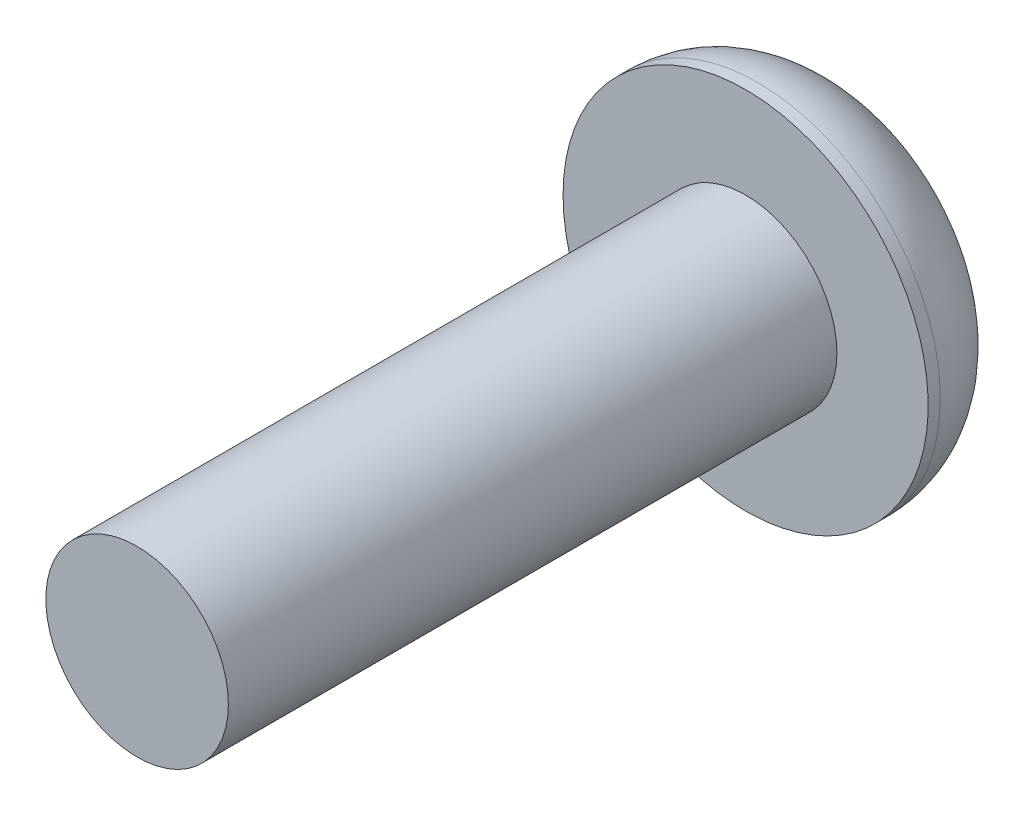
ISO-10303-21;
HEADER;
FILE_DESCRIPTION(('STEP AP214'),'2;1');
FILE_NAME('part.step','',(''),(''),'','','');
FILE_SCHEMA(('AUTOMOTIVE_DESIGN { 1 0 10303 214 1 1 1 1 }'));
ENDSEC;
DATA;
#1=APPLICATION_CONTEXT('core data for automotive mechanical design processes');
#2=APPLICATION_PROTOCOL_DEFINITION('international standard','automotive_design',2000,#1);
#3=PRODUCT_CONTEXT('',#1,'mechanical');
#4=PRODUCT('Part','Part','',(#3));
#5=PRODUCT_RELATED_PRODUCT_CATEGORY('part','',(#4));
#6=PRODUCT_DEFINITION_FORMATION('','',#4);
#7=PRODUCT_DEFINITION_CONTEXT('part definition',#1,'design');
#8=PRODUCT_DEFINITION('design','',#6,#7);
#9=PRODUCT_DEFINITION_SHAPE('','',#8);
#10=(LENGTH_UNIT() NAMED_UNIT(*) SI_UNIT(.MILLI.,.METRE.));
#11=(NAMED_UNIT(*) PLANE_ANGLE_UNIT() SI_UNIT($,.RADIAN.));
#12=(NAMED_UNIT(*) SI_UNIT($,.STERADIAN.) SOLID_ANGLE_UNIT());
#13=UNCERTAINTY_MEASURE_WITH_UNIT(LENGTH_MEASURE(1.E-05),#10,'distance_accuracy_value','');
#14=(GEOMETRIC_REPRESENTATION_CONTEXT(3) GLOBAL_UNCERTAINTY_ASSIGNED_CONTEXT((#13)) GLOBAL_UNIT_ASSIGNED_CONTEXT((#10,
#11,#12)) REPRESENTATION_CONTEXT('',''));
#15=CARTESIAN_POINT('',(0.,0.,0.));
#16=DIRECTION('',(0.,0.,1.));
#17=DIRECTION('',(1.,0.,0.));
#18=AXIS2_PLACEMENT_3D('',#15,#16,#17);
#19=CARTESIAN_POINT('',(0.,0.,10.));
#20=DIRECTION('',(0.,0.,-1.));
#21=DIRECTION('',(-1.,0.,0.));
#22=AXIS2_PLACEMENT_3D('',#19,#20,#21);
#23=CYLINDRICAL_SURFACE('',#22,1.5);
#24=CARTESIAN_POINT('',(0.,0.,10.));
#25=DIRECTION('',(0.,0.,1.));
#26=DIRECTION('',(1.,0.,0.));
#27=AXIS2_PLACEMENT_3D('',#24,#25,#26);
#28=CIRCLE('',#27,1.5);
#29=CARTESIAN_POINT('',(1.5,0.,10.));
#30=VERTEX_POINT('',#29);
#31=EDGE_CURVE('E42',#30,#30,#28,.T.);
#32=ORIENTED_EDGE('',*,*,#31,.F.);
#33=EDGE_LOOP('',(#32));
#34=FACE_BOUND('',#33,.T.);
#35=CARTESIAN_POINT('',(0.,0.,0.));
#36=DIRECTION('',(0.,0.,1.));
#37=DIRECTION('',(1.,0.,0.));
#38=AXIS2_PLACEMENT_3D('',#35,#36,#37);
#39=CIRCLE('',#38,1.5);
#40=CARTESIAN_POINT('',(1.5,0.,0.));
#41=VERTEX_POINT('',#40);
#42=EDGE_CURVE('E46',#41,#41,#39,.T.);
#43=ORIENTED_EDGE('',*,*,#42,.T.);
#44=EDGE_LOOP('',(#43));
#45=FACE_BOUND('',#44,.T.);
#46=ADVANCED_FACE('F31',(#34,#45),#23,.T.);
#47=CARTESIAN_POINT('',(0.,0.,10.));
#48=DIRECTION('',(0.,0.,1.));
#49=DIRECTION('',(1.,0.,0.));
#50=AXIS2_PLACEMENT_3D('',#47,#48,#49);
#51=PLANE('',#50);
#52=ORIENTED_EDGE('',*,*,#31,.T.);
#53=EDGE_LOOP('',(#52));
#54=FACE_BOUND('',#53,.T.);
#55=ADVANCED_FACE('F71',(#54),#51,.T.);
#56=CARTESIAN_POINT('',(0.,0.,-1.7));
#57=DIRECTION('',(0.,0.,1.));
#58=DIRECTION('',(1.,0.,0.));
#59=AXIS2_PLACEMENT_3D('',#56,#57,#58);
#60=CYLINDRICAL_SURFACE('',#59,3.);
#61=CARTESIAN_POINT('',(0.,0.,-0.2));
#62=DIRECTION('',(0.,0.,-1.));
#63=DIRECTION('',(-1.,0.,0.));
#64=AXIS2_PLACEMENT_3D('',#61,#62,#63);
#65=CIRCLE('',#64,3.);
#66=CARTESIAN_POINT('',(-3.,0.,-0.2));
#67=VERTEX_POINT('',#66);
#68=EDGE_CURVE('E10',#67,#67,#65,.F.);
#69=ORIENTED_EDGE('',*,*,#68,.T.);
#70=EDGE_LOOP('',(#69));
#71=FACE_BOUND('',#70,.T.);
#72=CARTESIAN_POINT('',(0.,0.,0.));
#73=DIRECTION('',(0.,0.,-1.));
#74=DIRECTION('',(-1.,0.,0.));
#75=AXIS2_PLACEMENT_3D('',#72,#73,#74);
#76=CIRCLE('',#75,3.);
#77=CARTESIAN_POINT('',(-3.,0.,0.));
#78=VERTEX_POINT('',#77);
#79=EDGE_CURVE('E50',#78,#78,#76,.T.);
#80=ORIENTED_EDGE('',*,*,#79,.T.);
#81=EDGE_LOOP('',(#80));
#82=FACE_BOUND('',#81,.T.);
#83=ADVANCED_FACE('F55',(#71,#82),#60,.T.);
#84=CARTESIAN_POINT('',(0.,0.,-1.7));
#85=DIRECTION('',(0.,0.,-1.));
#86=DIRECTION('',(-1.,0.,0.));
#87=AXIS2_PLACEMENT_3D('',#84,#85,#86);
#88=PLANE('',#87);
#89=CARTESIAN_POINT('',(0.,0.,-1.7));
#90=DIRECTION('',(0.,0.,-1.));
#91=DIRECTION('',(-1.,0.,0.));
#92=AXIS2_PLACEMENT_3D('',#89,#90,#91);
#93=CIRCLE('',#92,1.5);
#94=CARTESIAN_POINT('',(-1.5,0.,-1.7));
#95=VERTEX_POINT('',#94);
#96=EDGE_CURVE('E38',#95,#95,#93,.T.);
#97=ORIENTED_EDGE('',*,*,#96,.T.);
#98=EDGE_LOOP('',(#97));
#99=FACE_BOUND('',#98,.T.);
#100=ADVANCED_FACE('F59',(#99),#88,.T.);
#101=CARTESIAN_POINT('',(0.,0.,0.));
#102=DIRECTION('',(0.,0.,-1.));
#103=DIRECTION('',(-1.,0.,0.));
#104=AXIS2_PLACEMENT_3D('',#101,#102,#103);
#105=PLANE('',#104);
#106=ORIENTED_EDGE('',*,*,#42,.F.);
#107=EDGE_LOOP('',(#106));
#108=FACE_BOUND('',#107,.T.);
#109=ORIENTED_EDGE('',*,*,#79,.F.);
#110=EDGE_LOOP('',(#109));
#111=FACE_BOUND('',#110,.T.);
#112=ADVANCED_FACE('F57',(#108,#111),#105,.F.);
#113=CARTESIAN_POINT('',(0.,0.,-0.2));
#114=DIRECTION('',(0.,0.,-1.));
#115=DIRECTION('',(-1.,0.,0.));
#116=AXIS2_PLACEMENT_3D('',#113,#114,#115);
#117=TOROIDAL_SURFACE('',#116,1.5,1.5);
#118=ORIENTED_EDGE('',*,*,#68,.F.);
#119=EDGE_LOOP('',(#118));
#120=FACE_BOUND('',#119,.T.);
#121=ORIENTED_EDGE('',*,*,#96,.F.);
#122=EDGE_LOOP('',(#121));
#123=FACE_BOUND('',#122,.T.);
#124=ADVANCED_FACE('F33',(#120,#123),#117,.T.);
#125=CLOSED_SHELL('',(#46,#55,#83,#100,#112,#124));
#126=MANIFOLD_SOLID_BREP('B2',#125);
#127=ADVANCED_BREP_SHAPE_REPRESENTATION('',(#18,#126),#14);
#128=SHAPE_DEFINITION_REPRESENTATION(#9,#127);
ENDSEC;
END-ISO-10303-21;
